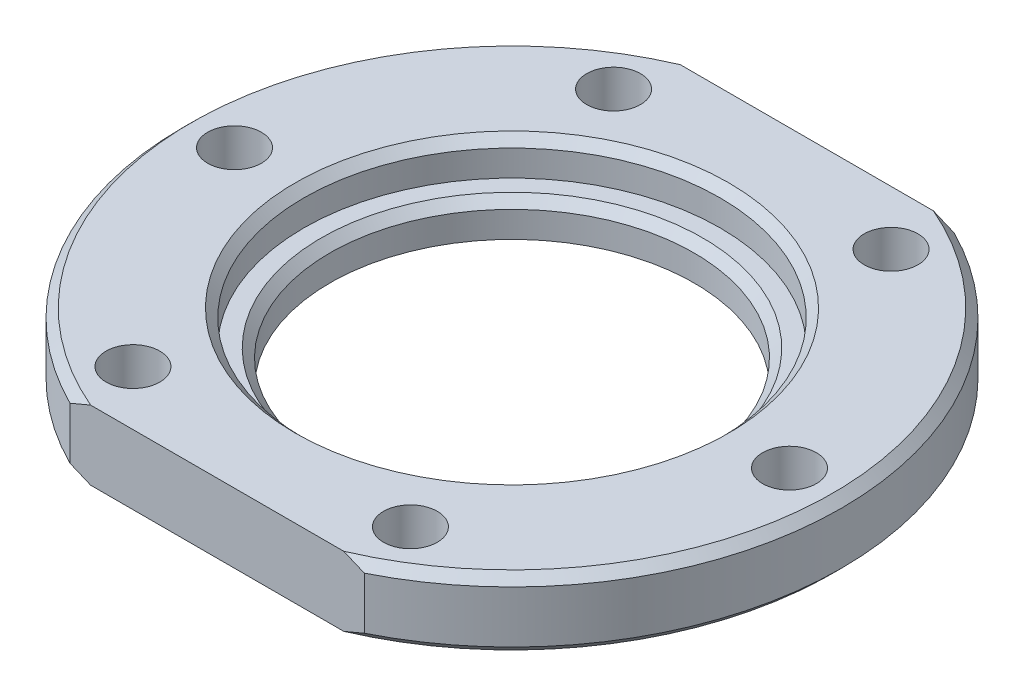
ISO-10303-21;
HEADER;
FILE_DESCRIPTION(('STEP AP214'),'2;1');
FILE_NAME('part.step','',(''),(''),'','','');
FILE_SCHEMA(('AUTOMOTIVE_DESIGN { 1 0 10303 214 1 1 1 1 }'));
ENDSEC;
DATA;
#1=APPLICATION_CONTEXT('core data for automotive mechanical design processes');
#2=APPLICATION_PROTOCOL_DEFINITION('international standard','automotive_design',2000,#1);
#3=PRODUCT_CONTEXT('',#1,'mechanical');
#4=PRODUCT('Part','Part','',(#3));
#5=PRODUCT_RELATED_PRODUCT_CATEGORY('part','',(#4));
#6=PRODUCT_DEFINITION_FORMATION('','',#4);
#7=PRODUCT_DEFINITION_CONTEXT('part definition',#1,'design');
#8=PRODUCT_DEFINITION('design','',#6,#7);
#9=PRODUCT_DEFINITION_SHAPE('','',#8);
#10=(LENGTH_UNIT() NAMED_UNIT(*) SI_UNIT(.MILLI.,.METRE.));
#11=(NAMED_UNIT(*) PLANE_ANGLE_UNIT() SI_UNIT($,.RADIAN.));
#12=(NAMED_UNIT(*) SI_UNIT($,.STERADIAN.) SOLID_ANGLE_UNIT());
#13=UNCERTAINTY_MEASURE_WITH_UNIT(LENGTH_MEASURE(1.E-05),#10,'distance_accuracy_value','');
#14=(GEOMETRIC_REPRESENTATION_CONTEXT(3) GLOBAL_UNCERTAINTY_ASSIGNED_CONTEXT((#13)) GLOBAL_UNIT_ASSIGNED_CONTEXT((#10,
#11,#12)) REPRESENTATION_CONTEXT('',''));
#15=CARTESIAN_POINT('',(0.,0.,0.));
#16=DIRECTION('',(0.,0.,1.));
#17=DIRECTION('',(1.,0.,0.));
#18=AXIS2_PLACEMENT_3D('',#15,#16,#17);
#19=CARTESIAN_POINT('',(0.,4.,0.));
#20=DIRECTION('',(0.,-1.,0.));
#21=DIRECTION('',(0.,0.,-1.));
#22=AXIS2_PLACEMENT_3D('',#19,#20,#21);
#23=CYLINDRICAL_SURFACE('',#22,10.5);
#24=CARTESIAN_POINT('',(0.,1.5,0.));
#25=DIRECTION('',(0.,1.,0.));
#26=DIRECTION('',(0.,0.,1.));
#27=AXIS2_PLACEMENT_3D('',#24,#25,#26);
#28=CIRCLE('',#27,10.5);
#29=CARTESIAN_POINT('',(0.,1.5,10.5));
#30=VERTEX_POINT('',#29);
#31=EDGE_CURVE('E248',#30,#30,#28,.T.);
#32=ORIENTED_EDGE('',*,*,#31,.T.);
#33=EDGE_LOOP('',(#32));
#34=FACE_BOUND('',#33,.T.);
#35=CARTESIAN_POINT('',(0.,0.,0.));
#36=DIRECTION('',(0.,1.,0.));
#37=DIRECTION('',(0.,0.,1.));
#38=AXIS2_PLACEMENT_3D('',#35,#36,#37);
#39=CIRCLE('',#38,10.5);
#40=CARTESIAN_POINT('',(0.,0.,10.5));
#41=VERTEX_POINT('',#40);
#42=EDGE_CURVE('E268',#41,#41,#39,.T.);
#43=ORIENTED_EDGE('',*,*,#42,.F.);
#44=EDGE_LOOP('',(#43));
#45=FACE_BOUND('',#44,.T.);
#46=ADVANCED_FACE('F35',(#34,#45),#23,.F.);
#47=CARTESIAN_POINT('',(0.,4.,0.));
#48=DIRECTION('',(0.,1.,0.));
#49=DIRECTION('',(0.,0.,1.));
#50=AXIS2_PLACEMENT_3D('',#47,#48,#49);
#51=PLANE('',#50);
#52=CARTESIAN_POINT('',(0.,4.,0.));
#53=DIRECTION('',(0.,1.,0.));
#54=DIRECTION('',(0.,0.,1.));
#55=AXIS2_PLACEMENT_3D('',#52,#53,#54);
#56=CIRCLE('',#55,12.5);
#57=CARTESIAN_POINT('',(0.,4.,12.5));
#58=VERTEX_POINT('',#57);
#59=EDGE_CURVE('E242',#58,#58,#56,.F.);
#60=ORIENTED_EDGE('',*,*,#59,.T.);
#61=EDGE_LOOP('',(#60));
#62=FACE_BOUND('',#61,.T.);
#63=CARTESIAN_POINT('',(7.99999999999987,4.,13.8564064605511));
#64=DIRECTION('',(0.,1.,0.));
#65=DIRECTION('',(0.,0.,1.));
#66=AXIS2_PLACEMENT_3D('',#63,#64,#65);
#67=CIRCLE('',#66,1.55);
#68=CARTESIAN_POINT('',(7.99999999999987,4.,15.4064064605511));
#69=VERTEX_POINT('',#68);
#70=EDGE_CURVE('E477',#69,#69,#67,.T.);
#71=ORIENTED_EDGE('',*,*,#70,.F.);
#72=EDGE_LOOP('',(#71));
#73=FACE_BOUND('',#72,.T.);
#74=CARTESIAN_POINT('',(8.00000000000007,4.,-13.856406460551));
#75=DIRECTION('',(0.,1.,0.));
#76=DIRECTION('',(0.,0.,1.));
#77=AXIS2_PLACEMENT_3D('',#74,#75,#76);
#78=CIRCLE('',#77,1.55);
#79=CARTESIAN_POINT('',(8.00000000000007,4.,-12.306406460551));
#80=VERTEX_POINT('',#79);
#81=EDGE_CURVE('E489',#80,#80,#78,.T.);
#82=ORIENTED_EDGE('',*,*,#81,.F.);
#83=EDGE_LOOP('',(#82));
#84=FACE_BOUND('',#83,.T.);
#85=CARTESIAN_POINT('',(-16.,4.,0.));
#86=DIRECTION('',(0.,1.,0.));
#87=DIRECTION('',(0.,0.,1.));
#88=AXIS2_PLACEMENT_3D('',#85,#86,#87);
#89=CIRCLE('',#88,1.55);
#90=CARTESIAN_POINT('',(-16.,4.,1.55));
#91=VERTEX_POINT('',#90);
#92=EDGE_CURVE('E269',#91,#91,#89,.T.);
#93=ORIENTED_EDGE('',*,*,#92,.F.);
#94=EDGE_LOOP('',(#93));
#95=FACE_BOUND('',#94,.T.);
#96=DIRECTION('',(1.,0.,0.));
#97=VECTOR('',#96,1.);
#98=CARTESIAN_POINT('',(-8.48528137423856,4.,17.));
#99=LINE('',#98,#97);
#100=CARTESIAN_POINT('',(-7.29725975966321,4.,17.));
#101=VERTEX_POINT('',#100);
#102=CARTESIAN_POINT('',(7.2972597596632,4.,17.));
#103=VERTEX_POINT('',#102);
#104=EDGE_CURVE('E109',#101,#103,#99,.T.);
#105=ORIENTED_EDGE('',*,*,#104,.T.);
#106=CARTESIAN_POINT('',(0.,4.,0.));
#107=DIRECTION('',(0.,1.,0.));
#108=DIRECTION('',(0.,0.,1.));
#109=AXIS2_PLACEMENT_3D('',#106,#107,#108);
#110=CIRCLE('',#109,18.5);
#111=CARTESIAN_POINT('',(7.29725975966321,4.,-17.));
#112=VERTEX_POINT('',#111);
#113=EDGE_CURVE('E245',#103,#112,#110,.T.);
#114=ORIENTED_EDGE('',*,*,#113,.T.);
#115=DIRECTION('',(-1.,0.,0.));
#116=VECTOR('',#115,1.);
#117=CARTESIAN_POINT('',(-8.48528137423857,4.,-17.));
#118=LINE('',#117,#116);
#119=CARTESIAN_POINT('',(-7.29725975966321,4.,-17.));
#120=VERTEX_POINT('',#119);
#121=EDGE_CURVE('E228',#112,#120,#118,.T.);
#122=ORIENTED_EDGE('',*,*,#121,.T.);
#123=CARTESIAN_POINT('',(0.,4.,0.));
#124=DIRECTION('',(0.,1.,0.));
#125=DIRECTION('',(0.,0.,1.));
#126=AXIS2_PLACEMENT_3D('',#123,#124,#125);
#127=CIRCLE('',#126,18.5);
#128=EDGE_CURVE('E238',#120,#101,#127,.T.);
#129=ORIENTED_EDGE('',*,*,#128,.T.);
#130=EDGE_LOOP('',(#105,#114,#122,#129));
#131=FACE_BOUND('',#130,.T.);
#132=CARTESIAN_POINT('',(-7.99999999999997,4.,-13.856406460551));
#133=DIRECTION('',(0.,1.,0.));
#134=DIRECTION('',(0.,0.,1.));
#135=AXIS2_PLACEMENT_3D('',#132,#133,#134);
#136=CIRCLE('',#135,1.55);
#137=CARTESIAN_POINT('',(-7.99999999999997,4.,-12.306406460551));
#138=VERTEX_POINT('',#137);
#139=EDGE_CURVE('E495',#138,#138,#136,.T.);
#140=ORIENTED_EDGE('',*,*,#139,.F.);
#141=EDGE_LOOP('',(#140));
#142=FACE_BOUND('',#141,.T.);
#143=CARTESIAN_POINT('',(16.,4.,1.1172740284298E-13));
#144=DIRECTION('',(0.,1.,0.));
#145=DIRECTION('',(0.,0.,1.));
#146=AXIS2_PLACEMENT_3D('',#143,#144,#145);
#147=CIRCLE('',#146,1.55);
#148=CARTESIAN_POINT('',(16.,4.,1.55000000000011));
#149=VERTEX_POINT('',#148);
#150=EDGE_CURVE('E483',#149,#149,#147,.T.);
#151=ORIENTED_EDGE('',*,*,#150,.F.);
#152=EDGE_LOOP('',(#151));
#153=FACE_BOUND('',#152,.T.);
#154=CARTESIAN_POINT('',(-8.00000000000016,4.,13.8564064605509));
#155=DIRECTION('',(0.,1.,0.));
#156=DIRECTION('',(0.,0.,1.));
#157=AXIS2_PLACEMENT_3D('',#154,#155,#156);
#158=CIRCLE('',#157,1.55);
#159=CARTESIAN_POINT('',(-8.00000000000016,4.,15.4064064605509));
#160=VERTEX_POINT('',#159);
#161=EDGE_CURVE('E471',#160,#160,#158,.T.);
#162=ORIENTED_EDGE('',*,*,#161,.F.);
#163=EDGE_LOOP('',(#162));
#164=FACE_BOUND('',#163,.T.);
#165=ADVANCED_FACE('F264',(#62,#73,#84,#95,#131,#142,#153,#164),#51,.T.);
#166=CARTESIAN_POINT('',(0.,0.,0.));
#167=DIRECTION('',(0.,1.,0.));
#168=DIRECTION('',(0.,0.,1.));
#169=AXIS2_PLACEMENT_3D('',#166,#167,#168);
#170=PLANE('',#169);
#171=DIRECTION('',(1.,0.,0.));
#172=VECTOR('',#171,1.);
#173=CARTESIAN_POINT('',(-8.48528137423856,0.,17.));
#174=LINE('',#173,#172);
#175=CARTESIAN_POINT('',(-7.29725975966321,0.,17.));
#176=VERTEX_POINT('',#175);
#177=CARTESIAN_POINT('',(7.29725975966318,0.,17.));
#178=VERTEX_POINT('',#177);
#179=EDGE_CURVE('E222',#176,#178,#174,.T.);
#180=ORIENTED_EDGE('',*,*,#179,.F.);
#181=CARTESIAN_POINT('',(0.,0.,0.));
#182=DIRECTION('',(0.,1.,0.));
#183=DIRECTION('',(0.,0.,1.));
#184=AXIS2_PLACEMENT_3D('',#181,#182,#183);
#185=CIRCLE('',#184,18.5);
#186=CARTESIAN_POINT('',(-7.29725975966321,0.,-17.));
#187=VERTEX_POINT('',#186);
#188=EDGE_CURVE('E216',#176,#187,#185,.F.);
#189=ORIENTED_EDGE('',*,*,#188,.T.);
#190=DIRECTION('',(-1.,0.,0.));
#191=VECTOR('',#190,1.);
#192=CARTESIAN_POINT('',(-8.48528137423857,0.,-17.));
#193=LINE('',#192,#191);
#194=CARTESIAN_POINT('',(7.29725975966319,0.,-17.));
#195=VERTEX_POINT('',#194);
#196=EDGE_CURVE('E229',#195,#187,#193,.T.);
#197=ORIENTED_EDGE('',*,*,#196,.F.);
#198=CARTESIAN_POINT('',(0.,0.,0.));
#199=DIRECTION('',(0.,1.,0.));
#200=DIRECTION('',(0.,0.,1.));
#201=AXIS2_PLACEMENT_3D('',#198,#199,#200);
#202=CIRCLE('',#201,18.5);
#203=EDGE_CURVE('E217',#195,#178,#202,.F.);
#204=ORIENTED_EDGE('',*,*,#203,.T.);
#205=EDGE_LOOP('',(#180,#189,#197,#204));
#206=FACE_BOUND('',#205,.T.);
#207=ORIENTED_EDGE('',*,*,#42,.T.);
#208=EDGE_LOOP('',(#207));
#209=FACE_BOUND('',#208,.T.);
#210=CARTESIAN_POINT('',(-16.,0.,0.));
#211=DIRECTION('',(0.,1.,0.));
#212=DIRECTION('',(0.,0.,1.));
#213=AXIS2_PLACEMENT_3D('',#210,#211,#212);
#214=CIRCLE('',#213,1.55);
#215=CARTESIAN_POINT('',(-16.,0.,1.55));
#216=VERTEX_POINT('',#215);
#217=EDGE_CURVE('E273',#216,#216,#214,.T.);
#218=ORIENTED_EDGE('',*,*,#217,.T.);
#219=EDGE_LOOP('',(#218));
#220=FACE_BOUND('',#219,.T.);
#221=CARTESIAN_POINT('',(-7.99999999999997,0.,-13.856406460551));
#222=DIRECTION('',(0.,1.,0.));
#223=DIRECTION('',(0.,0.,1.));
#224=AXIS2_PLACEMENT_3D('',#221,#222,#223);
#225=CIRCLE('',#224,1.55);
#226=CARTESIAN_POINT('',(-7.99999999999997,0.,-12.306406460551));
#227=VERTEX_POINT('',#226);
#228=EDGE_CURVE('E492',#227,#227,#225,.T.);
#229=ORIENTED_EDGE('',*,*,#228,.T.);
#230=EDGE_LOOP('',(#229));
#231=FACE_BOUND('',#230,.T.);
#232=CARTESIAN_POINT('',(8.00000000000007,0.,-13.856406460551));
#233=DIRECTION('',(0.,1.,0.));
#234=DIRECTION('',(0.,0.,1.));
#235=AXIS2_PLACEMENT_3D('',#232,#233,#234);
#236=CIRCLE('',#235,1.55);
#237=CARTESIAN_POINT('',(8.00000000000007,0.,-12.306406460551));
#238=VERTEX_POINT('',#237);
#239=EDGE_CURVE('E486',#238,#238,#236,.T.);
#240=ORIENTED_EDGE('',*,*,#239,.T.);
#241=EDGE_LOOP('',(#240));
#242=FACE_BOUND('',#241,.T.);
#243=CARTESIAN_POINT('',(16.,0.,1.1172740284298E-13));
#244=DIRECTION('',(0.,1.,0.));
#245=DIRECTION('',(0.,0.,1.));
#246=AXIS2_PLACEMENT_3D('',#243,#244,#245);
#247=CIRCLE('',#246,1.55);
#248=CARTESIAN_POINT('',(16.,0.,1.55000000000011));
#249=VERTEX_POINT('',#248);
#250=EDGE_CURVE('E480',#249,#249,#247,.T.);
#251=ORIENTED_EDGE('',*,*,#250,.T.);
#252=EDGE_LOOP('',(#251));
#253=FACE_BOUND('',#252,.T.);
#254=CARTESIAN_POINT('',(7.99999999999987,0.,13.8564064605511));
#255=DIRECTION('',(0.,1.,0.));
#256=DIRECTION('',(0.,0.,1.));
#257=AXIS2_PLACEMENT_3D('',#254,#255,#256);
#258=CIRCLE('',#257,1.55);
#259=CARTESIAN_POINT('',(7.99999999999987,0.,15.4064064605511));
#260=VERTEX_POINT('',#259);
#261=EDGE_CURVE('E475',#260,#260,#258,.T.);
#262=ORIENTED_EDGE('',*,*,#261,.T.);
#263=EDGE_LOOP('',(#262));
#264=FACE_BOUND('',#263,.T.);
#265=CARTESIAN_POINT('',(-8.00000000000016,0.,13.8564064605509));
#266=DIRECTION('',(0.,1.,0.));
#267=DIRECTION('',(0.,0.,1.));
#268=AXIS2_PLACEMENT_3D('',#265,#266,#267);
#269=CIRCLE('',#268,1.55);
#270=CARTESIAN_POINT('',(-8.00000000000016,0.,15.4064064605509));
#271=VERTEX_POINT('',#270);
#272=EDGE_CURVE('E468',#271,#271,#269,.T.);
#273=ORIENTED_EDGE('',*,*,#272,.T.);
#274=EDGE_LOOP('',(#273));
#275=FACE_BOUND('',#274,.T.);
#276=ADVANCED_FACE('F151',(#206,#209,#220,#231,#242,#253,#264,#275),#170,.F.);
#277=CARTESIAN_POINT('',(0.,4.,0.));
#278=DIRECTION('',(0.,-1.,0.));
#279=DIRECTION('',(0.,0.,-1.));
#280=AXIS2_PLACEMENT_3D('',#277,#278,#279);
#281=CYLINDRICAL_SURFACE('',#280,19.);
#282=DIRECTION('',(0.,-1.,0.));
#283=VECTOR('',#282,1.);
#284=CARTESIAN_POINT('',(8.48528137423856,4.,17.));
#285=LINE('',#284,#283);
#286=CARTESIAN_POINT('',(8.48528137423856,3.5,17.));
#287=VERTEX_POINT('',#286);
#288=CARTESIAN_POINT('',(8.48528137423856,0.500000000000004,17.));
#289=VERTEX_POINT('',#288);
#290=EDGE_CURVE('E125',#287,#289,#285,.T.);
#291=ORIENTED_EDGE('',*,*,#290,.T.);
#292=CARTESIAN_POINT('',(0.,0.500000000000004,0.));
#293=DIRECTION('',(0.,1.,0.));
#294=DIRECTION('',(0.,0.,1.));
#295=AXIS2_PLACEMENT_3D('',#292,#293,#294);
#296=CIRCLE('',#295,19.);
#297=CARTESIAN_POINT('',(8.48528137423857,0.500000000000004,-17.));
#298=VERTEX_POINT('',#297);
#299=EDGE_CURVE('E233',#289,#298,#296,.T.);
#300=ORIENTED_EDGE('',*,*,#299,.T.);
#301=DIRECTION('',(0.,-1.,0.));
#302=VECTOR('',#301,1.);
#303=CARTESIAN_POINT('',(8.48528137423857,4.,-17.));
#304=LINE('',#303,#302);
#305=CARTESIAN_POINT('',(8.48528137423857,3.5,-17.));
#306=VERTEX_POINT('',#305);
#307=EDGE_CURVE('E129',#306,#298,#304,.T.);
#308=ORIENTED_EDGE('',*,*,#307,.F.);
#309=CARTESIAN_POINT('',(0.,3.5,0.));
#310=DIRECTION('',(0.,1.,0.));
#311=DIRECTION('',(0.,0.,1.));
#312=AXIS2_PLACEMENT_3D('',#309,#310,#311);
#313=CIRCLE('',#312,19.);
#314=EDGE_CURVE('E232',#306,#287,#313,.F.);
#315=ORIENTED_EDGE('',*,*,#314,.T.);
#316=EDGE_LOOP('',(#291,#300,#308,#315));
#317=FACE_BOUND('',#316,.T.);
#318=ADVANCED_FACE('F207',(#317),#281,.T.);
#319=CARTESIAN_POINT('',(-8.48528137423857,4.,-17.));
#320=DIRECTION('',(0.,0.,1.));
#321=DIRECTION('',(1.,0.,0.));
#322=AXIS2_PLACEMENT_3D('',#319,#320,#321);
#323=PLANE('',#322);
#324=ORIENTED_EDGE('',*,*,#196,.T.);
#325=CARTESIAN_POINT('',(-7.29725975966321,0.,-17.));
#326=CARTESIAN_POINT('',(-7.39719487948351,0.0394191850347742,-17.));
#327=CARTESIAN_POINT('',(-7.49689622621429,0.0794296704768801,-17.));
#328=CARTESIAN_POINT('',(-7.69582202053383,0.160584933755774,-17.));
#329=CARTESIAN_POINT('',(-7.79504652511086,0.201729571878803,-17.));
#330=CARTESIAN_POINT('',(-7.99303326311037,0.285114298994637,-17.));
#331=CARTESIAN_POINT('',(-8.09179549900561,0.327354382119748,-17.));
#332=CARTESIAN_POINT('',(-8.28887455002269,0.412894043845017,-17.));
#333=CARTESIAN_POINT('',(-8.38719130902525,0.456193751763003,-17.));
#334=CARTESIAN_POINT('',(-8.48528137423857,0.49999999999999,-17.));
#335=B_SPLINE_CURVE_WITH_KNOTS('',3,(#325,#326,#327,#328,#329,#330,#331,#332,#333,#334),
.UNSPECIFIED.,.F.,.F.,(4,2,2,2,4),(0.,0.322283148753814,0.644526772037853,0.96676866959723,
1.28905009200688),.UNSPECIFIED.);
#336=CARTESIAN_POINT('',(-8.48528137423857,0.500000000000004,-17.));
#337=VERTEX_POINT('',#336);
#338=EDGE_CURVE('E193',#187,#337,#335,.T.);
#339=ORIENTED_EDGE('',*,*,#338,.T.);
#340=DIRECTION('',(0.,-1.,0.));
#341=VECTOR('',#340,1.);
#342=CARTESIAN_POINT('',(-8.48528137423857,4.,-17.));
#343=LINE('',#342,#341);
#344=CARTESIAN_POINT('',(-8.48528137423857,3.5,-17.));
#345=VERTEX_POINT('',#344);
#346=EDGE_CURVE('E124',#345,#337,#343,.T.);
#347=ORIENTED_EDGE('',*,*,#346,.F.);
#348=CARTESIAN_POINT('',(-8.48528137423857,3.5,-17.));
#349=CARTESIAN_POINT('',(-8.38719130902525,3.543806248237,-17.));
#350=CARTESIAN_POINT('',(-8.28887455002269,3.58710595615498,-17.));
#351=CARTESIAN_POINT('',(-8.09179549900561,3.67264561788026,-17.));
#352=CARTESIAN_POINT('',(-7.99303326311037,3.71488570100537,-17.));
#353=CARTESIAN_POINT('',(-7.79504652511087,3.7982704281212,-17.));
#354=CARTESIAN_POINT('',(-7.69582202053383,3.83941506624423,-17.));
#355=CARTESIAN_POINT('',(-7.4968962262143,3.92057032952312,-17.));
#356=CARTESIAN_POINT('',(-7.39719487948352,3.96058081496524,-17.));
#357=CARTESIAN_POINT('',(-7.29725975966323,4.00000000000003,-17.));
#358=B_SPLINE_CURVE_WITH_KNOTS('',3,(#348,#349,#350,#351,#352,#353,#354,#355,#356,#357),
.UNSPECIFIED.,.F.,.F.,(4,2,2,2,4),(0.,0.32228142240965,0.644523319969025,0.966766943253064,
1.28905009200688),.UNSPECIFIED.);
#359=EDGE_CURVE('E128',#345,#120,#358,.T.);
#360=ORIENTED_EDGE('',*,*,#359,.T.);
#361=ORIENTED_EDGE('',*,*,#121,.F.);
#362=CARTESIAN_POINT('',(7.29725975966321,4.,-17.));
#363=CARTESIAN_POINT('',(7.39719487948352,3.96058081496523,-17.));
#364=CARTESIAN_POINT('',(7.4968962262143,3.92057032952312,-17.));
#365=CARTESIAN_POINT('',(7.69582202053383,3.83941506624423,-17.));
#366=CARTESIAN_POINT('',(7.79504652511087,3.7982704281212,-17.));
#367=CARTESIAN_POINT('',(7.99303326311037,3.71488570100536,-17.));
#368=CARTESIAN_POINT('',(8.09179549900561,3.67264561788025,-17.));
#369=CARTESIAN_POINT('',(8.2888745500227,3.58710595615498,-17.));
#370=CARTESIAN_POINT('',(8.38719130902526,3.543806248237,-17.));
#371=CARTESIAN_POINT('',(8.48528137423858,3.50000000000001,-17.));
#372=B_SPLINE_CURVE_WITH_KNOTS('',3,(#362,#363,#364,#365,#366,#367,#368,#369,#370,#371),
.UNSPECIFIED.,.F.,.F.,(4,2,2,2,4),(0.,0.322283148753813,0.644526772037852,0.966768669597231,
1.28905009200688),.UNSPECIFIED.);
#373=EDGE_CURVE('E60',#112,#306,#372,.T.);
#374=ORIENTED_EDGE('',*,*,#373,.T.);
#375=ORIENTED_EDGE('',*,*,#307,.T.);
#376=CARTESIAN_POINT('',(8.48528137423857,0.500000000000004,-17.));
#377=CARTESIAN_POINT('',(8.38719130902525,0.45619375176301,-17.));
#378=CARTESIAN_POINT('',(8.2888745500227,0.41289404384502,-17.));
#379=CARTESIAN_POINT('',(8.09179549900561,0.327354382119747,-17.));
#380=CARTESIAN_POINT('',(7.99303326311037,0.285114298994636,-17.));
#381=CARTESIAN_POINT('',(7.79504652511086,0.201729571878803,-17.));
#382=CARTESIAN_POINT('',(7.69582202053382,0.160584933755775,-17.));
#383=CARTESIAN_POINT('',(7.49689622621428,0.0794296704768758,-17.));
#384=CARTESIAN_POINT('',(7.3971948794835,0.0394191850347633,-17.));
#385=CARTESIAN_POINT('',(7.29725975966321,0.,-17.));
#386=B_SPLINE_CURVE_WITH_KNOTS('',3,(#376,#377,#378,#379,#380,#381,#382,#383,#384,#385),
.UNSPECIFIED.,.F.,.F.,(4,2,2,2,4),(0.,0.322281422409656,0.644523319969038,0.966766943253084,
1.2890500920069),.UNSPECIFIED.);
#387=EDGE_CURVE('E52',#298,#195,#386,.T.);
#388=ORIENTED_EDGE('',*,*,#387,.T.);
#389=EDGE_LOOP('',(#324,#339,#347,#360,#361,#374,#375,#388));
#390=FACE_BOUND('',#389,.T.);
#391=ADVANCED_FACE('F204',(#390),#323,.F.);
#392=CARTESIAN_POINT('',(0.,4.,0.));
#393=DIRECTION('',(0.,-1.,0.));
#394=DIRECTION('',(0.,0.,-1.));
#395=AXIS2_PLACEMENT_3D('',#392,#393,#394);
#396=CYLINDRICAL_SURFACE('',#395,19.);
#397=ORIENTED_EDGE('',*,*,#346,.T.);
#398=CARTESIAN_POINT('',(0.,0.500000000000004,0.));
#399=DIRECTION('',(0.,1.,0.));
#400=DIRECTION('',(0.,0.,1.));
#401=AXIS2_PLACEMENT_3D('',#398,#399,#400);
#402=CIRCLE('',#401,19.);
#403=CARTESIAN_POINT('',(-8.48528137423856,0.500000000000004,17.));
#404=VERTEX_POINT('',#403);
#405=EDGE_CURVE('E115',#337,#404,#402,.T.);
#406=ORIENTED_EDGE('',*,*,#405,.T.);
#407=DIRECTION('',(0.,-1.,0.));
#408=VECTOR('',#407,1.);
#409=CARTESIAN_POINT('',(-8.48528137423856,4.,17.));
#410=LINE('',#409,#408);
#411=CARTESIAN_POINT('',(-8.48528137423856,3.5,17.));
#412=VERTEX_POINT('',#411);
#413=EDGE_CURVE('E107',#412,#404,#410,.T.);
#414=ORIENTED_EDGE('',*,*,#413,.F.);
#415=CARTESIAN_POINT('',(0.,3.5,0.));
#416=DIRECTION('',(0.,1.,0.));
#417=DIRECTION('',(0.,0.,1.));
#418=AXIS2_PLACEMENT_3D('',#415,#416,#417);
#419=CIRCLE('',#418,19.);
#420=EDGE_CURVE('E121',#412,#345,#419,.F.);
#421=ORIENTED_EDGE('',*,*,#420,.T.);
#422=EDGE_LOOP('',(#397,#406,#414,#421));
#423=FACE_BOUND('',#422,.T.);
#424=ADVANCED_FACE('F120',(#423),#396,.T.);
#425=CARTESIAN_POINT('',(-8.48528137423856,4.,17.));
#426=DIRECTION('',(0.,0.,-1.));
#427=DIRECTION('',(-1.,0.,0.));
#428=AXIS2_PLACEMENT_3D('',#425,#426,#427);
#429=PLANE('',#428);
#430=ORIENTED_EDGE('',*,*,#413,.T.);
#431=CARTESIAN_POINT('',(-8.48528137423856,0.500000000000004,17.));
#432=CARTESIAN_POINT('',(-8.38719130902525,0.45619375176301,17.));
#433=CARTESIAN_POINT('',(-8.28887455002269,0.41289404384502,17.));
#434=CARTESIAN_POINT('',(-8.09179549900561,0.327354382119747,17.));
#435=CARTESIAN_POINT('',(-7.99303326311037,0.285114298994636,17.));
#436=CARTESIAN_POINT('',(-7.79504652511086,0.201729571878804,17.));
#437=CARTESIAN_POINT('',(-7.69582202053383,0.160584933755777,17.));
#438=CARTESIAN_POINT('',(-7.49689622621429,0.0794296704768804,17.));
#439=CARTESIAN_POINT('',(-7.39719487948351,0.039419185034769,17.));
#440=CARTESIAN_POINT('',(-7.29725975966321,0.,17.));
#441=B_SPLINE_CURVE_WITH_KNOTS('',3,(#431,#432,#433,#434,#435,#436,#437,#438,#439,#440),
.UNSPECIFIED.,.F.,.F.,(4,2,2,2,4),(0.,0.322281422409651,0.64452331996903,0.966766943253069,
1.28905009200688),.UNSPECIFIED.);
#442=EDGE_CURVE('E164',#404,#176,#441,.T.);
#443=ORIENTED_EDGE('',*,*,#442,.T.);
#444=ORIENTED_EDGE('',*,*,#179,.T.);
#445=CARTESIAN_POINT('',(7.29725975966318,0.,17.));
#446=CARTESIAN_POINT('',(7.39719487948349,0.0394191850347707,17.));
#447=CARTESIAN_POINT('',(7.49689622621427,0.0794296704768762,17.));
#448=CARTESIAN_POINT('',(7.69582202053381,0.160584933755771,17.));
#449=CARTESIAN_POINT('',(7.79504652511085,0.201729571878802,17.));
#450=CARTESIAN_POINT('',(7.99303326311035,0.285114298994637,17.));
#451=CARTESIAN_POINT('',(8.09179549900559,0.327354382119748,17.));
#452=CARTESIAN_POINT('',(8.28887455002268,0.412894043845016,17.));
#453=CARTESIAN_POINT('',(8.38719130902524,0.456193751763002,17.));
#454=CARTESIAN_POINT('',(8.48528137423856,0.49999999999999,17.));
#455=B_SPLINE_CURVE_WITH_KNOTS('',3,(#445,#446,#447,#448,#449,#450,#451,#452,#453,#454),
.UNSPECIFIED.,.F.,.F.,(4,2,2,2,4),(0.,0.322283148753818,0.644526772037862,0.966768669597244,
1.2890500920069),.UNSPECIFIED.);
#456=EDGE_CURVE('E158',#178,#289,#455,.T.);
#457=ORIENTED_EDGE('',*,*,#456,.T.);
#458=ORIENTED_EDGE('',*,*,#290,.F.);
#459=CARTESIAN_POINT('',(8.48528137423856,3.5,17.));
#460=CARTESIAN_POINT('',(8.38719130902524,3.543806248237,17.));
#461=CARTESIAN_POINT('',(8.28887455002268,3.58710595615498,17.));
#462=CARTESIAN_POINT('',(8.0917954990056,3.67264561788026,17.));
#463=CARTESIAN_POINT('',(7.99303326311036,3.71488570100537,17.));
#464=CARTESIAN_POINT('',(7.79504652511086,3.7982704281212,17.));
#465=CARTESIAN_POINT('',(7.69582202053382,3.83941506624423,17.));
#466=CARTESIAN_POINT('',(7.49689622621429,3.92057032952312,17.));
#467=CARTESIAN_POINT('',(7.39719487948351,3.96058081496524,17.));
#468=CARTESIAN_POINT('',(7.29725975966321,4.00000000000002,17.));
#469=B_SPLINE_CURVE_WITH_KNOTS('',3,(#459,#460,#461,#462,#463,#464,#465,#466,#467,#468),
.UNSPECIFIED.,.F.,.F.,(4,2,2,2,4),(0.,0.322281422409651,0.644523319969028,0.966766943253067,
1.28905009200688),.UNSPECIFIED.);
#470=EDGE_CURVE('E114',#287,#103,#469,.T.);
#471=ORIENTED_EDGE('',*,*,#470,.T.);
#472=ORIENTED_EDGE('',*,*,#104,.F.);
#473=CARTESIAN_POINT('',(-7.29725975966321,4.,17.));
#474=CARTESIAN_POINT('',(-7.39719487948352,3.96058081496523,17.));
#475=CARTESIAN_POINT('',(-7.4968962262143,3.92057032952312,17.));
#476=CARTESIAN_POINT('',(-7.69582202053383,3.83941506624423,17.));
#477=CARTESIAN_POINT('',(-7.79504652511087,3.7982704281212,17.));
#478=CARTESIAN_POINT('',(-7.99303326311037,3.71488570100537,17.));
#479=CARTESIAN_POINT('',(-8.09179549900561,3.67264561788026,17.));
#480=CARTESIAN_POINT('',(-8.28887455002269,3.58710595615499,17.));
#481=CARTESIAN_POINT('',(-8.38719130902525,3.543806248237,17.));
#482=CARTESIAN_POINT('',(-8.48528137423857,3.50000000000001,17.));
#483=B_SPLINE_CURVE_WITH_KNOTS('',3,(#473,#474,#475,#476,#477,#478,#479,#480,#481,#482),
.UNSPECIFIED.,.F.,.F.,(4,2,2,2,4),(0.,0.322283148753813,0.64452677203785,0.966768669597226,
1.28905009200688),.UNSPECIFIED.);
#484=EDGE_CURVE('E104',#101,#412,#483,.T.);
#485=ORIENTED_EDGE('',*,*,#484,.T.);
#486=EDGE_LOOP('',(#430,#443,#444,#457,#458,#471,#472,#485));
#487=FACE_BOUND('',#486,.T.);
#488=ADVANCED_FACE('F106',(#487),#429,.F.);
#489=CARTESIAN_POINT('',(-16.,4.,0.));
#490=DIRECTION('',(0.,-1.,0.));
#491=DIRECTION('',(0.,0.,-1.));
#492=AXIS2_PLACEMENT_3D('',#489,#490,#491);
#493=CYLINDRICAL_SURFACE('',#492,1.55);
#494=ORIENTED_EDGE('',*,*,#92,.T.);
#495=EDGE_LOOP('',(#494));
#496=FACE_BOUND('',#495,.T.);
#497=ORIENTED_EDGE('',*,*,#217,.F.);
#498=EDGE_LOOP('',(#497));
#499=FACE_BOUND('',#498,.T.);
#500=ADVANCED_FACE('F150',(#496,#499),#493,.F.);
#501=CARTESIAN_POINT('',(-7.99999999999997,4.,-13.856406460551));
#502=DIRECTION('',(0.,-1.,0.));
#503=DIRECTION('',(0.,0.,-1.));
#504=AXIS2_PLACEMENT_3D('',#501,#502,#503);
#505=CYLINDRICAL_SURFACE('',#504,1.55);
#506=ORIENTED_EDGE('',*,*,#139,.T.);
#507=EDGE_LOOP('',(#506));
#508=FACE_BOUND('',#507,.T.);
#509=ORIENTED_EDGE('',*,*,#228,.F.);
#510=EDGE_LOOP('',(#509));
#511=FACE_BOUND('',#510,.T.);
#512=ADVANCED_FACE('F299',(#508,#511),#505,.F.);
#513=CARTESIAN_POINT('',(8.00000000000007,4.,-13.856406460551));
#514=DIRECTION('',(0.,-1.,0.));
#515=DIRECTION('',(0.,0.,-1.));
#516=AXIS2_PLACEMENT_3D('',#513,#514,#515);
#517=CYLINDRICAL_SURFACE('',#516,1.55);
#518=ORIENTED_EDGE('',*,*,#81,.T.);
#519=EDGE_LOOP('',(#518));
#520=FACE_BOUND('',#519,.T.);
#521=ORIENTED_EDGE('',*,*,#239,.F.);
#522=EDGE_LOOP('',(#521));
#523=FACE_BOUND('',#522,.T.);
#524=ADVANCED_FACE('F303',(#520,#523),#517,.F.);
#525=CARTESIAN_POINT('',(16.,4.,1.1172740284298E-13));
#526=DIRECTION('',(0.,-1.,0.));
#527=DIRECTION('',(0.,0.,-1.));
#528=AXIS2_PLACEMENT_3D('',#525,#526,#527);
#529=CYLINDRICAL_SURFACE('',#528,1.55);
#530=ORIENTED_EDGE('',*,*,#150,.T.);
#531=EDGE_LOOP('',(#530));
#532=FACE_BOUND('',#531,.T.);
#533=ORIENTED_EDGE('',*,*,#250,.F.);
#534=EDGE_LOOP('',(#533));
#535=FACE_BOUND('',#534,.T.);
#536=ADVANCED_FACE('F307',(#532,#535),#529,.F.);
#537=CARTESIAN_POINT('',(7.99999999999987,4.,13.8564064605511));
#538=DIRECTION('',(0.,-1.,0.));
#539=DIRECTION('',(0.,0.,-1.));
#540=AXIS2_PLACEMENT_3D('',#537,#538,#539);
#541=CYLINDRICAL_SURFACE('',#540,1.55);
#542=ORIENTED_EDGE('',*,*,#70,.T.);
#543=EDGE_LOOP('',(#542));
#544=FACE_BOUND('',#543,.T.);
#545=ORIENTED_EDGE('',*,*,#261,.F.);
#546=EDGE_LOOP('',(#545));
#547=FACE_BOUND('',#546,.T.);
#548=ADVANCED_FACE('F311',(#544,#547),#541,.F.);
#549=CARTESIAN_POINT('',(-8.00000000000016,4.,13.8564064605509));
#550=DIRECTION('',(0.,-1.,0.));
#551=DIRECTION('',(0.,0.,-1.));
#552=AXIS2_PLACEMENT_3D('',#549,#550,#551);
#553=CYLINDRICAL_SURFACE('',#552,1.55);
#554=ORIENTED_EDGE('',*,*,#161,.T.);
#555=EDGE_LOOP('',(#554));
#556=FACE_BOUND('',#555,.T.);
#557=ORIENTED_EDGE('',*,*,#272,.F.);
#558=EDGE_LOOP('',(#557));
#559=FACE_BOUND('',#558,.T.);
#560=ADVANCED_FACE('F315',(#556,#559),#553,.F.);
#561=CARTESIAN_POINT('',(0.,2.,0.));
#562=DIRECTION('',(0.,1.,0.));
#563=DIRECTION('',(0.,0.,1.));
#564=AXIS2_PLACEMENT_3D('',#561,#562,#563);
#565=CYLINDRICAL_SURFACE('',#564,12.);
#566=CARTESIAN_POINT('',(0.,3.5,0.));
#567=DIRECTION('',(0.,1.,0.));
#568=DIRECTION('',(0.,0.,1.));
#569=AXIS2_PLACEMENT_3D('',#566,#567,#568);
#570=CIRCLE('',#569,12.);
#571=CARTESIAN_POINT('',(0.,3.5,12.));
#572=VERTEX_POINT('',#571);
#573=EDGE_CURVE('E11',#572,#572,#570,.T.);
#574=ORIENTED_EDGE('',*,*,#573,.T.);
#575=EDGE_LOOP('',(#574));
#576=FACE_BOUND('',#575,.T.);
#577=CARTESIAN_POINT('',(0.,2.,0.));
#578=DIRECTION('',(0.,1.,0.));
#579=DIRECTION('',(0.,0.,1.));
#580=AXIS2_PLACEMENT_3D('',#577,#578,#579);
#581=CIRCLE('',#580,12.);
#582=CARTESIAN_POINT('',(0.,2.,12.));
#583=VERTEX_POINT('',#582);
#584=EDGE_CURVE('E467',#583,#583,#581,.T.);
#585=ORIENTED_EDGE('',*,*,#584,.F.);
#586=EDGE_LOOP('',(#585));
#587=FACE_BOUND('',#586,.T.);
#588=ADVANCED_FACE('F319',(#576,#587),#565,.F.);
#589=CARTESIAN_POINT('',(0.,2.,0.));
#590=DIRECTION('',(0.,1.,0.));
#591=DIRECTION('',(0.,0.,1.));
#592=AXIS2_PLACEMENT_3D('',#589,#590,#591);
#593=PLANE('',#592);
#594=CARTESIAN_POINT('',(0.,2.,0.));
#595=DIRECTION('',(0.,1.,0.));
#596=DIRECTION('',(0.,0.,1.));
#597=AXIS2_PLACEMENT_3D('',#594,#595,#596);
#598=CIRCLE('',#597,11.);
#599=CARTESIAN_POINT('',(0.,2.,11.));
#600=VERTEX_POINT('',#599);
#601=EDGE_CURVE('E45',#600,#600,#598,.F.);
#602=ORIENTED_EDGE('',*,*,#601,.T.);
#603=EDGE_LOOP('',(#602));
#604=FACE_BOUND('',#603,.T.);
#605=ORIENTED_EDGE('',*,*,#584,.T.);
#606=EDGE_LOOP('',(#605));
#607=FACE_BOUND('',#606,.T.);
#608=ADVANCED_FACE('F253',(#604,#607),#593,.T.);
#609=CARTESIAN_POINT('',(0.,0.500000000000004,0.));
#610=DIRECTION('',(0.,1.,0.));
#611=DIRECTION('',(0.,0.,1.));
#612=AXIS2_PLACEMENT_3D('',#609,#610,#611);
#613=CONICAL_SURFACE('',#612,19.,0.785398163397452);
#614=ORIENTED_EDGE('',*,*,#338,.F.);
#615=ORIENTED_EDGE('',*,*,#188,.F.);
#616=ORIENTED_EDGE('',*,*,#442,.F.);
#617=ORIENTED_EDGE('',*,*,#405,.F.);
#618=EDGE_LOOP('',(#614,#615,#616,#617));
#619=FACE_BOUND('',#618,.T.);
#620=ADVANCED_FACE('F180',(#619),#613,.T.);
#621=CARTESIAN_POINT('',(0.,0.500000000000004,0.));
#622=DIRECTION('',(0.,1.,0.));
#623=DIRECTION('',(0.,0.,1.));
#624=AXIS2_PLACEMENT_3D('',#621,#622,#623);
#625=CONICAL_SURFACE('',#624,19.,0.785398163397452);
#626=ORIENTED_EDGE('',*,*,#456,.F.);
#627=ORIENTED_EDGE('',*,*,#203,.F.);
#628=ORIENTED_EDGE('',*,*,#387,.F.);
#629=ORIENTED_EDGE('',*,*,#299,.F.);
#630=EDGE_LOOP('',(#626,#627,#628,#629));
#631=FACE_BOUND('',#630,.T.);
#632=ADVANCED_FACE('F172',(#631),#625,.T.);
#633=CARTESIAN_POINT('',(0.,4.,0.));
#634=DIRECTION('',(0.,-1.,0.));
#635=DIRECTION('',(0.,0.,-1.));
#636=AXIS2_PLACEMENT_3D('',#633,#634,#635);
#637=CONICAL_SURFACE('',#636,18.5,0.785398163397448);
#638=ORIENTED_EDGE('',*,*,#470,.F.);
#639=ORIENTED_EDGE('',*,*,#314,.F.);
#640=ORIENTED_EDGE('',*,*,#373,.F.);
#641=ORIENTED_EDGE('',*,*,#113,.F.);
#642=EDGE_LOOP('',(#638,#639,#640,#641));
#643=FACE_BOUND('',#642,.T.);
#644=ADVANCED_FACE('F179',(#643),#637,.T.);
#645=CARTESIAN_POINT('',(0.,1.5,0.));
#646=DIRECTION('',(0.,1.,0.));
#647=DIRECTION('',(0.,0.,1.));
#648=AXIS2_PLACEMENT_3D('',#645,#646,#647);
#649=CONICAL_SURFACE('',#648,10.5,0.785398163397452);
#650=ORIENTED_EDGE('',*,*,#601,.F.);
#651=EDGE_LOOP('',(#650));
#652=FACE_BOUND('',#651,.T.);
#653=ORIENTED_EDGE('',*,*,#31,.F.);
#654=EDGE_LOOP('',(#653));
#655=FACE_BOUND('',#654,.T.);
#656=ADVANCED_FACE('F256',(#652,#655),#649,.F.);
#657=CARTESIAN_POINT('',(0.,3.5,0.));
#658=DIRECTION('',(0.,1.,0.));
#659=DIRECTION('',(0.,0.,1.));
#660=AXIS2_PLACEMENT_3D('',#657,#658,#659);
#661=CONICAL_SURFACE('',#660,12.,0.785398163397448);
#662=ORIENTED_EDGE('',*,*,#59,.F.);
#663=EDGE_LOOP('',(#662));
#664=FACE_BOUND('',#663,.T.);
#665=ORIENTED_EDGE('',*,*,#573,.F.);
#666=EDGE_LOOP('',(#665));
#667=FACE_BOUND('',#666,.T.);
#668=ADVANCED_FACE('F259',(#664,#667),#661,.F.);
#669=CARTESIAN_POINT('',(0.,4.,0.));
#670=DIRECTION('',(0.,-1.,0.));
#671=DIRECTION('',(0.,0.,-1.));
#672=AXIS2_PLACEMENT_3D('',#669,#670,#671);
#673=CONICAL_SURFACE('',#672,18.5,0.785398163397448);
#674=ORIENTED_EDGE('',*,*,#359,.F.);
#675=ORIENTED_EDGE('',*,*,#420,.F.);
#676=ORIENTED_EDGE('',*,*,#484,.F.);
#677=ORIENTED_EDGE('',*,*,#128,.F.);
#678=EDGE_LOOP('',(#674,#675,#676,#677));
#679=FACE_BOUND('',#678,.T.);
#680=ADVANCED_FACE('F38',(#679),#673,.T.);
#681=CLOSED_SHELL('',(#46,#165,#276,#318,#391,#424,#488,#500,#512,#524,#536,#548,#560,#588,#608,
#620,#632,#644,#656,#668,#680));
#682=MANIFOLD_SOLID_BREP('B2',#681);
#683=ADVANCED_BREP_SHAPE_REPRESENTATION('',(#18,#682),#14);
#684=SHAPE_DEFINITION_REPRESENTATION(#9,#683);
ENDSEC;
END-ISO-10303-21;
